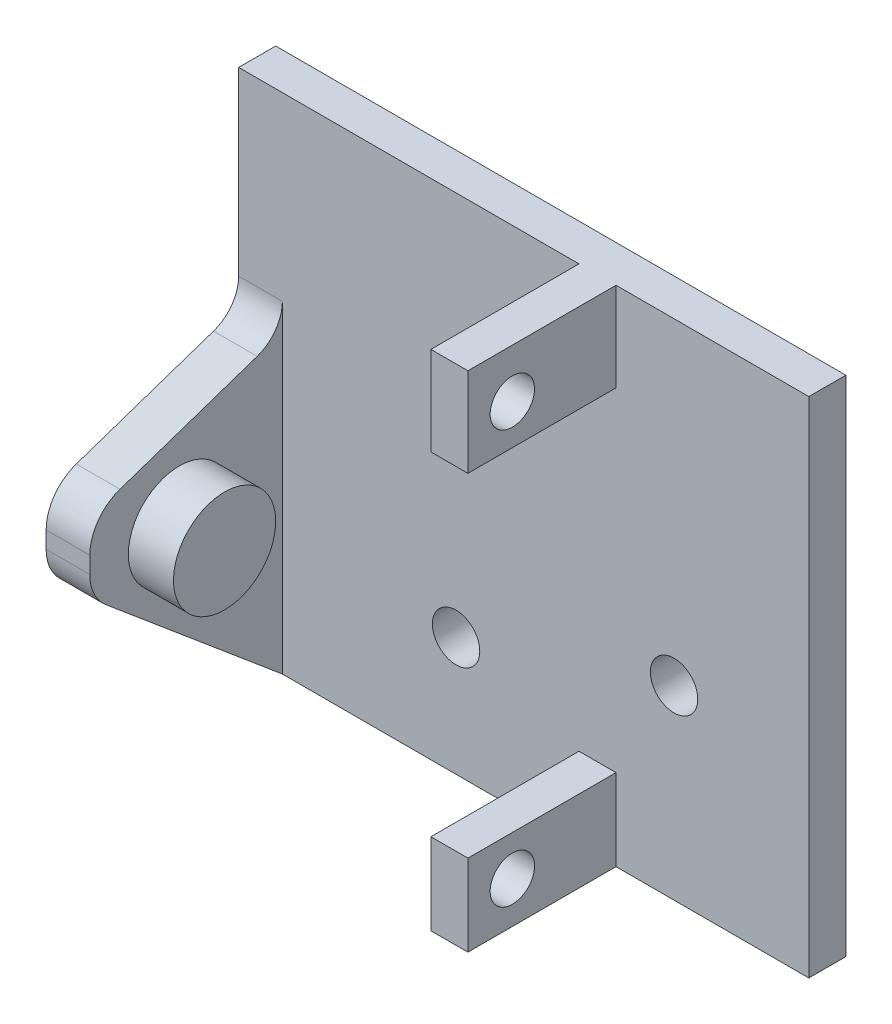
ISO-10303-21;
HEADER;
FILE_DESCRIPTION(('STEP AP214'),'2;1');
FILE_NAME('part.step','',(''),(''),'','','');
FILE_SCHEMA(('AUTOMOTIVE_DESIGN { 1 0 10303 214 1 1 1 1 }'));
ENDSEC;
DATA;
#1=APPLICATION_CONTEXT('core data for automotive mechanical design processes');
#2=APPLICATION_PROTOCOL_DEFINITION('international standard','automotive_design',2000,#1);
#3=PRODUCT_CONTEXT('',#1,'mechanical');
#4=PRODUCT('Part','Part','',(#3));
#5=PRODUCT_RELATED_PRODUCT_CATEGORY('part','',(#4));
#6=PRODUCT_DEFINITION_FORMATION('','',#4);
#7=PRODUCT_DEFINITION_CONTEXT('part definition',#1,'design');
#8=PRODUCT_DEFINITION('design','',#6,#7);
#9=PRODUCT_DEFINITION_SHAPE('','',#8);
#10=(LENGTH_UNIT() NAMED_UNIT(*) SI_UNIT(.MILLI.,.METRE.));
#11=(NAMED_UNIT(*) PLANE_ANGLE_UNIT() SI_UNIT($,.RADIAN.));
#12=(NAMED_UNIT(*) SI_UNIT($,.STERADIAN.) SOLID_ANGLE_UNIT());
#13=UNCERTAINTY_MEASURE_WITH_UNIT(LENGTH_MEASURE(1.E-05),#10,'distance_accuracy_value','');
#14=(GEOMETRIC_REPRESENTATION_CONTEXT(3) GLOBAL_UNCERTAINTY_ASSIGNED_CONTEXT((#13)) GLOBAL_UNIT_ASSIGNED_CONTEXT((#10,
#11,#12)) REPRESENTATION_CONTEXT('',''));
#15=CARTESIAN_POINT('',(0.,0.,0.));
#16=DIRECTION('',(0.,0.,1.));
#17=DIRECTION('',(1.,0.,0.));
#18=AXIS2_PLACEMENT_3D('',#15,#16,#17);
#19=CARTESIAN_POINT('',(-22.6450142317514,6.71013779527559,2.5));
#20=DIRECTION('',(1.,0.,0.));
#21=DIRECTION('',(0.,1.,0.));
#22=AXIS2_PLACEMENT_3D('',#19,#20,#21);
#23=PLANE('',#22);
#24=DIRECTION('',(0.,0.64331211729061,0.765604022812755));
#25=VECTOR('',#24,1.);
#26=CARTESIAN_POINT('',(-22.6450142317514,-17.2272454875677,14.4754931262982));
#27=LINE('',#26,#25);
#28=CARTESIAN_POINT('',(-22.6450142317514,-27.2898622047244,2.49999999999998));
#29=VERTEX_POINT('',#28);
#30=CARTESIAN_POINT('',(-22.6450142317514,-17.2655253608963,14.4299363518718));
#31=VERTEX_POINT('',#30);
#32=EDGE_CURVE('E185',#29,#31,#27,.T.);
#33=ORIENTED_EDGE('',*,*,#32,.T.);
#34=CARTESIAN_POINT('',(-22.6450142317514,-14.9687132924581,12.5));
#35=DIRECTION('',(1.,0.,0.));
#36=DIRECTION('',(0.,1.,0.));
#37=AXIS2_PLACEMENT_3D('',#34,#35,#36);
#38=CIRCLE('',#37,3.);
#39=CARTESIAN_POINT('',(-22.6450142317514,-14.9687132924581,15.5));
#40=VERTEX_POINT('',#39);
#41=EDGE_CURVE('E229',#31,#40,#38,.F.);
#42=ORIENTED_EDGE('',*,*,#41,.T.);
#43=DIRECTION('',(0.,-1.,0.));
#44=VECTOR('',#43,1.);
#45=CARTESIAN_POINT('',(-22.6450142317514,-7.28986220472441,15.5));
#46=LINE('',#45,#44);
#47=CARTESIAN_POINT('',(-22.6450142317514,-13.84136194244,15.5));
#48=VERTEX_POINT('',#47);
#49=EDGE_CURVE('E262',#48,#40,#46,.T.);
#50=ORIENTED_EDGE('',*,*,#49,.F.);
#51=CARTESIAN_POINT('',(-22.6450142317514,-13.84136194244,12.5));
#52=DIRECTION('',(1.,0.,0.));
#53=DIRECTION('',(0.,1.,0.));
#54=AXIS2_PLACEMENT_3D('',#51,#52,#53);
#55=CIRCLE('',#54,3.);
#56=CARTESIAN_POINT('',(-22.6450142317514,-10.9996910491199,13.4617206112261));
#57=VERTEX_POINT('',#56);
#58=EDGE_CURVE('E227',#48,#57,#55,.F.);
#59=ORIENTED_EDGE('',*,*,#58,.T.);
#60=DIRECTION('',(0.,0.320573537075366,-0.947223631106714));
#61=VECTOR('',#60,1.);
#62=CARTESIAN_POINT('',(-22.6450142317514,-5.78156499843623,-1.95668338554259));
#63=LINE('',#62,#61);
#64=CARTESIAN_POINT('',(-22.6450142317514,-7.86471627626999,4.19856615731159));
#65=VERTEX_POINT('',#64);
#66=EDGE_CURVE('E203',#57,#65,#63,.T.);
#67=ORIENTED_EDGE('',*,*,#66,.T.);
#68=CARTESIAN_POINT('',(-22.6450142317514,-5.49665719850321,5.));
#69=DIRECTION('',(1.,0.,0.));
#70=DIRECTION('',(0.,1.,0.));
#71=AXIS2_PLACEMENT_3D('',#68,#69,#70);
#72=CIRCLE('',#71,2.5);
#73=CARTESIAN_POINT('',(-22.6450142317514,-5.49665719850321,2.5));
#74=VERTEX_POINT('',#73);
#75=EDGE_CURVE('E66',#65,#74,#72,.T.);
#76=ORIENTED_EDGE('',*,*,#75,.T.);
#77=DIRECTION('',(0.,-1.,0.));
#78=VECTOR('',#77,1.);
#79=CARTESIAN_POINT('',(-22.6450142317514,6.71013779527559,2.5));
#80=LINE('',#79,#78);
#81=CARTESIAN_POINT('',(-22.6450142317514,6.71013779527559,2.5));
#82=VERTEX_POINT('',#81);
#83=EDGE_CURVE('E241',#82,#74,#80,.T.);
#84=ORIENTED_EDGE('',*,*,#83,.F.);
#85=DIRECTION('',(0.,0.,-1.));
#86=VECTOR('',#85,1.);
#87=CARTESIAN_POINT('',(-22.6450142317514,6.71013779527559,2.5));
#88=LINE('',#87,#86);
#89=CARTESIAN_POINT('',(-22.6450142317514,6.71013779527559,0.));
#90=VERTEX_POINT('',#89);
#91=EDGE_CURVE('E343',#82,#90,#88,.T.);
#92=ORIENTED_EDGE('',*,*,#91,.T.);
#93=DIRECTION('',(0.,-1.,0.));
#94=VECTOR('',#93,1.);
#95=CARTESIAN_POINT('',(-22.6450142317514,6.71013779527559,0.));
#96=LINE('',#95,#94);
#97=CARTESIAN_POINT('',(-22.6450142317514,-27.2898622047244,0.));
#98=VERTEX_POINT('',#97);
#99=EDGE_CURVE('E208',#90,#98,#96,.T.);
#100=ORIENTED_EDGE('',*,*,#99,.T.);
#101=DIRECTION('',(0.,0.,-1.));
#102=VECTOR('',#101,1.);
#103=CARTESIAN_POINT('',(-22.6450142317514,-27.2898622047244,2.5));
#104=LINE('',#103,#102);
#105=EDGE_CURVE('E199',#29,#98,#104,.T.);
#106=ORIENTED_EDGE('',*,*,#105,.F.);
#107=EDGE_LOOP('',(#33,#42,#50,#59,#67,#76,#84,#92,#100,#106));
#108=FACE_BOUND('',#107,.T.);
#109=ADVANCED_FACE('F58',(#108),#23,.F.);
#110=CARTESIAN_POINT('',(-22.6450142317514,-27.2898622047244,2.5));
#111=DIRECTION('',(0.,1.,0.));
#112=DIRECTION('',(0.,0.,1.));
#113=AXIS2_PLACEMENT_3D('',#110,#111,#112);
#114=PLANE('',#113);
#115=DIRECTION('',(-1.,0.,0.));
#116=VECTOR('',#115,1.);
#117=CARTESIAN_POINT('',(-7.64501423175144,-27.2898622047244,2.49999999999998));
#118=LINE('',#117,#116);
#119=CARTESIAN_POINT('',(-19.6950142317514,-27.2898622047244,2.49999999999998));
#120=VERTEX_POINT('',#119);
#121=EDGE_CURVE('E189',#120,#29,#118,.T.);
#122=ORIENTED_EDGE('',*,*,#121,.T.);
#123=ORIENTED_EDGE('',*,*,#105,.T.);
#124=DIRECTION('',(1.,0.,0.));
#125=VECTOR('',#124,1.);
#126=CARTESIAN_POINT('',(-22.6450142317514,-27.2898622047244,0.));
#127=LINE('',#126,#125);
#128=CARTESIAN_POINT('',(15.8549857682486,-27.2898622047244,0.));
#129=VERTEX_POINT('',#128);
#130=EDGE_CURVE('E345',#98,#129,#127,.T.);
#131=ORIENTED_EDGE('',*,*,#130,.T.);
#132=DIRECTION('',(0.,0.,-1.));
#133=VECTOR('',#132,1.);
#134=CARTESIAN_POINT('',(15.8549857682486,-27.2898622047244,2.5));
#135=LINE('',#134,#133);
#136=CARTESIAN_POINT('',(15.8549857682486,-27.2898622047244,2.5));
#137=VERTEX_POINT('',#136);
#138=EDGE_CURVE('E210',#137,#129,#135,.T.);
#139=ORIENTED_EDGE('',*,*,#138,.F.);
#140=DIRECTION('',(1.,0.,0.));
#141=VECTOR('',#140,1.);
#142=CARTESIAN_POINT('',(-22.6450142317514,-27.2898622047244,2.5));
#143=LINE('',#142,#141);
#144=CARTESIAN_POINT('',(2.83498576824857,-27.2898622047244,2.5));
#145=VERTEX_POINT('',#144);
#146=EDGE_CURVE('E334',#145,#137,#143,.T.);
#147=ORIENTED_EDGE('',*,*,#146,.F.);
#148=DIRECTION('',(0.,0.,-1.));
#149=VECTOR('',#148,1.);
#150=CARTESIAN_POINT('',(2.83498576824857,-27.2898622047244,12.5));
#151=LINE('',#150,#149);
#152=CARTESIAN_POINT('',(2.83498576824857,-27.2898622047244,12.5));
#153=VERTEX_POINT('',#152);
#154=EDGE_CURVE('E330',#153,#145,#151,.T.);
#155=ORIENTED_EDGE('',*,*,#154,.F.);
#156=DIRECTION('',(1.,0.,0.));
#157=VECTOR('',#156,1.);
#158=CARTESIAN_POINT('',(2.83498576824857,-27.2898622047244,12.5));
#159=LINE('',#158,#157);
#160=CARTESIAN_POINT('',(0.334985768248565,-27.2898622047244,12.5));
#161=VERTEX_POINT('',#160);
#162=EDGE_CURVE('E305',#161,#153,#159,.T.);
#163=ORIENTED_EDGE('',*,*,#162,.F.);
#164=DIRECTION('',(0.,0.,-1.));
#165=VECTOR('',#164,1.);
#166=CARTESIAN_POINT('',(0.334985768248565,-27.2898622047244,12.5));
#167=LINE('',#166,#165);
#168=CARTESIAN_POINT('',(0.334985768248565,-27.2898622047244,2.5));
#169=VERTEX_POINT('',#168);
#170=EDGE_CURVE('E315',#161,#169,#167,.T.);
#171=ORIENTED_EDGE('',*,*,#170,.T.);
#172=EDGE_CURVE('E202',#120,#169,#143,.T.);
#173=ORIENTED_EDGE('',*,*,#172,.F.);
#174=EDGE_LOOP('',(#122,#123,#131,#139,#147,#155,#163,#171,#173));
#175=FACE_BOUND('',#174,.T.);
#176=ADVANCED_FACE('F198',(#175),#114,.F.);
#177=CARTESIAN_POINT('',(-19.6950142317514,-27.2898622047244,15.5));
#178=DIRECTION('',(-1.,0.,0.));
#179=DIRECTION('',(0.,0.,1.));
#180=AXIS2_PLACEMENT_3D('',#177,#178,#179);
#181=PLANE('',#180);
#182=CARTESIAN_POINT('',(-19.6950142317514,-15.0898622047244,9.45));
#183=DIRECTION('',(-1.,0.,0.));
#184=DIRECTION('',(0.,0.,1.));
#185=AXIS2_PLACEMENT_3D('',#182,#183,#184);
#186=CIRCLE('',#185,3.45);
#187=CARTESIAN_POINT('',(-19.6950142317514,-15.0898622047244,12.9));
#188=VERTEX_POINT('',#187);
#189=EDGE_CURVE('E194',#188,#188,#186,.T.);
#190=ORIENTED_EDGE('',*,*,#189,.T.);
#191=EDGE_LOOP('',(#190));
#192=FACE_BOUND('',#191,.T.);
#193=DIRECTION('',(0.,1.,0.));
#194=VECTOR('',#193,1.);
#195=CARTESIAN_POINT('',(-19.6950142317514,-27.2898622047244,15.5));
#196=LINE('',#195,#194);
#197=CARTESIAN_POINT('',(-19.6950142317514,-14.9687132924581,15.5));
#198=VERTEX_POINT('',#197);
#199=CARTESIAN_POINT('',(-19.6950142317514,-13.84136194244,15.5));
#200=VERTEX_POINT('',#199);
#201=EDGE_CURVE('E259',#198,#200,#196,.T.);
#202=ORIENTED_EDGE('',*,*,#201,.F.);
#203=CARTESIAN_POINT('',(-19.6950142317514,-14.9687132924581,12.5));
#204=DIRECTION('',(-1.,0.,0.));
#205=DIRECTION('',(0.,0.,1.));
#206=AXIS2_PLACEMENT_3D('',#203,#204,#205);
#207=CIRCLE('',#206,3.);
#208=CARTESIAN_POINT('',(-19.6950142317514,-17.2655253608963,14.4299363518718));
#209=VERTEX_POINT('',#208);
#210=EDGE_CURVE('E224',#198,#209,#207,.F.);
#211=ORIENTED_EDGE('',*,*,#210,.T.);
#212=DIRECTION('',(0.,0.64331211729061,0.765604022812755));
#213=VECTOR('',#212,1.);
#214=CARTESIAN_POINT('',(-19.6950142317514,-20.88707172074,10.1199437567119));
#215=LINE('',#214,#213);
#216=EDGE_CURVE('E254',#120,#209,#215,.T.);
#217=ORIENTED_EDGE('',*,*,#216,.F.);
#218=DIRECTION('',(0.,1.,0.));
#219=VECTOR('',#218,1.);
#220=CARTESIAN_POINT('',(-19.6950142317514,-27.2898622047244,2.5));
#221=LINE('',#220,#219);
#222=CARTESIAN_POINT('',(-19.6950142317514,-5.49665719850321,2.5));
#223=VERTEX_POINT('',#222);
#224=EDGE_CURVE('E72',#120,#223,#221,.T.);
#225=ORIENTED_EDGE('',*,*,#224,.T.);
#226=CARTESIAN_POINT('',(-19.6950142317514,-5.49665719850321,5.));
#227=DIRECTION('',(-1.,0.,0.));
#228=DIRECTION('',(0.,0.,1.));
#229=AXIS2_PLACEMENT_3D('',#226,#227,#228);
#230=CIRCLE('',#229,2.5);
#231=CARTESIAN_POINT('',(-19.6950142317514,-7.86471627626999,4.19856615731158));
#232=VERTEX_POINT('',#231);
#233=EDGE_CURVE('E12',#223,#232,#230,.T.);
#234=ORIENTED_EDGE('',*,*,#233,.T.);
#235=DIRECTION('',(0.,0.320573537075366,-0.947223631106715));
#236=VECTOR('',#235,1.);
#237=CARTESIAN_POINT('',(-19.6950142317514,-13.2927228459129,20.2371204917559));
#238=LINE('',#237,#236);
#239=CARTESIAN_POINT('',(-19.6950142317514,-10.9996910491199,13.4617206112261));
#240=VERTEX_POINT('',#239);
#241=EDGE_CURVE('E248',#240,#232,#238,.T.);
#242=ORIENTED_EDGE('',*,*,#241,.F.);
#243=CARTESIAN_POINT('',(-19.6950142317514,-13.84136194244,12.5));
#244=DIRECTION('',(-1.,0.,0.));
#245=DIRECTION('',(0.,0.,1.));
#246=AXIS2_PLACEMENT_3D('',#243,#244,#245);
#247=CIRCLE('',#246,3.);
#248=EDGE_CURVE('E222',#240,#200,#247,.F.);
#249=ORIENTED_EDGE('',*,*,#248,.T.);
#250=EDGE_LOOP('',(#202,#211,#217,#225,#234,#242,#249));
#251=FACE_BOUND('',#250,.T.);
#252=ADVANCED_FACE('F247',(#192,#251),#181,.F.);
#253=CARTESIAN_POINT('',(0.,0.,15.5));
#254=DIRECTION('',(0.,0.,1.));
#255=DIRECTION('',(1.,0.,0.));
#256=AXIS2_PLACEMENT_3D('',#253,#254,#255);
#257=PLANE('',#256);
#258=ORIENTED_EDGE('',*,*,#49,.T.);
#259=DIRECTION('',(1.,0.,0.));
#260=VECTOR('',#259,1.);
#261=CARTESIAN_POINT('',(0.,-14.9687132924581,15.5));
#262=LINE('',#261,#260);
#263=EDGE_CURVE('E213',#40,#198,#262,.T.);
#264=ORIENTED_EDGE('',*,*,#263,.T.);
#265=ORIENTED_EDGE('',*,*,#201,.T.);
#266=DIRECTION('',(-1.,0.,0.));
#267=VECTOR('',#266,1.);
#268=CARTESIAN_POINT('',(0.,-13.84136194244,15.5));
#269=LINE('',#268,#267);
#270=EDGE_CURVE('E209',#200,#48,#269,.T.);
#271=ORIENTED_EDGE('',*,*,#270,.T.);
#272=EDGE_LOOP('',(#258,#264,#265,#271));
#273=FACE_BOUND('',#272,.T.);
#274=ADVANCED_FACE('F411',(#273),#257,.T.);
#275=CARTESIAN_POINT('',(0.,0.,2.5));
#276=DIRECTION('',(0.,0.,1.));
#277=DIRECTION('',(1.,0.,0.));
#278=AXIS2_PLACEMENT_3D('',#275,#276,#277);
#279=PLANE('',#278);
#280=CARTESIAN_POINT('',(-7.96501423175144,-19.2898622047244,2.5));
#281=DIRECTION('',(0.,0.,1.));
#282=DIRECTION('',(1.,0.,0.));
#283=AXIS2_PLACEMENT_3D('',#280,#281,#282);
#284=CIRCLE('',#283,1.6);
#285=CARTESIAN_POINT('',(-6.36501423175144,-19.2898622047244,2.5));
#286=VERTEX_POINT('',#285);
#287=EDGE_CURVE('E616',#286,#286,#284,.T.);
#288=ORIENTED_EDGE('',*,*,#287,.F.);
#289=EDGE_LOOP('',(#288));
#290=FACE_BOUND('',#289,.T.);
#291=CARTESIAN_POINT('',(6.75498576824856,-14.7398622047244,2.5));
#292=DIRECTION('',(0.,0.,1.));
#293=DIRECTION('',(1.,0.,0.));
#294=AXIS2_PLACEMENT_3D('',#291,#292,#293);
#295=CIRCLE('',#294,1.6);
#296=CARTESIAN_POINT('',(8.35498576824856,-14.7398622047244,2.5));
#297=VERTEX_POINT('',#296);
#298=EDGE_CURVE('E620',#297,#297,#295,.T.);
#299=ORIENTED_EDGE('',*,*,#298,.F.);
#300=EDGE_LOOP('',(#299));
#301=FACE_BOUND('',#300,.T.);
#302=ORIENTED_EDGE('',*,*,#83,.T.);
#303=DIRECTION('',(-1.,0.,0.));
#304=VECTOR('',#303,1.);
#305=CARTESIAN_POINT('',(-19.6950142317514,-5.49665719850321,2.5));
#306=LINE('',#305,#304);
#307=EDGE_CURVE('E236',#74,#223,#306,.F.);
#308=ORIENTED_EDGE('',*,*,#307,.T.);
#309=ORIENTED_EDGE('',*,*,#224,.F.);
#310=ORIENTED_EDGE('',*,*,#172,.T.);
#311=DIRECTION('',(0.,-1.,0.));
#312=VECTOR('',#311,1.);
#313=CARTESIAN_POINT('',(0.334985768248565,-27.2898622047244,2.5));
#314=LINE('',#313,#312);
#315=CARTESIAN_POINT('',(0.334985768248567,-21.7898622047244,2.5));
#316=VERTEX_POINT('',#315);
#317=EDGE_CURVE('E309',#316,#169,#314,.T.);
#318=ORIENTED_EDGE('',*,*,#317,.F.);
#319=DIRECTION('',(-1.,0.,0.));
#320=VECTOR('',#319,1.);
#321=CARTESIAN_POINT('',(0.334985768248567,-21.7898622047244,2.5));
#322=LINE('',#321,#320);
#323=CARTESIAN_POINT('',(2.83498576824857,-21.7898622047244,2.5));
#324=VERTEX_POINT('',#323);
#325=EDGE_CURVE('E318',#324,#316,#322,.T.);
#326=ORIENTED_EDGE('',*,*,#325,.F.);
#327=DIRECTION('',(0.,1.,0.));
#328=VECTOR('',#327,1.);
#329=CARTESIAN_POINT('',(2.83498576824857,-21.7898622047244,2.5));
#330=LINE('',#329,#328);
#331=EDGE_CURVE('E304',#145,#324,#330,.T.);
#332=ORIENTED_EDGE('',*,*,#331,.F.);
#333=ORIENTED_EDGE('',*,*,#146,.T.);
#334=DIRECTION('',(0.,1.,0.));
#335=VECTOR('',#334,1.);
#336=CARTESIAN_POINT('',(15.8549857682486,6.71013779527559,2.5));
#337=LINE('',#336,#335);
#338=CARTESIAN_POINT('',(15.8549857682486,6.71013779527559,2.5));
#339=VERTEX_POINT('',#338);
#340=EDGE_CURVE('E337',#137,#339,#337,.T.);
#341=ORIENTED_EDGE('',*,*,#340,.T.);
#342=DIRECTION('',(-1.,0.,0.));
#343=VECTOR('',#342,1.);
#344=CARTESIAN_POINT('',(-22.6450142317514,6.71013779527559,2.5));
#345=LINE('',#344,#343);
#346=CARTESIAN_POINT('',(2.83498576824856,6.71013779527559,2.5));
#347=VERTEX_POINT('',#346);
#348=EDGE_CURVE('E340',#339,#347,#345,.T.);
#349=ORIENTED_EDGE('',*,*,#348,.T.);
#350=DIRECTION('',(0.,1.,0.));
#351=VECTOR('',#350,1.);
#352=CARTESIAN_POINT('',(2.83498576824856,6.71013779527559,2.5));
#353=LINE('',#352,#351);
#354=CARTESIAN_POINT('',(2.83498576824856,0.710137795275591,2.5));
#355=VERTEX_POINT('',#354);
#356=EDGE_CURVE('E283',#355,#347,#353,.T.);
#357=ORIENTED_EDGE('',*,*,#356,.F.);
#358=DIRECTION('',(1.,0.,0.));
#359=VECTOR('',#358,1.);
#360=CARTESIAN_POINT('',(0.334985768248563,0.710137795275591,2.5));
#361=LINE('',#360,#359);
#362=CARTESIAN_POINT('',(0.334985768248563,0.710137795275591,2.5));
#363=VERTEX_POINT('',#362);
#364=EDGE_CURVE('E291',#363,#355,#361,.T.);
#365=ORIENTED_EDGE('',*,*,#364,.F.);
#366=DIRECTION('',(0.,-1.,0.));
#367=VECTOR('',#366,1.);
#368=CARTESIAN_POINT('',(0.334985768248563,6.71013779527559,2.5));
#369=LINE('',#368,#367);
#370=CARTESIAN_POINT('',(0.334985768248563,6.71013779527559,2.5));
#371=VERTEX_POINT('',#370);
#372=EDGE_CURVE('E274',#371,#363,#369,.T.);
#373=ORIENTED_EDGE('',*,*,#372,.F.);
#374=EDGE_CURVE('E339',#371,#82,#345,.T.);
#375=ORIENTED_EDGE('',*,*,#374,.T.);
#376=EDGE_LOOP('',(#302,#308,#309,#310,#318,#326,#332,#333,#341,#349,#357,#365,#373,#375));
#377=FACE_BOUND('',#376,.T.);
#378=ADVANCED_FACE('F240',(#290,#301,#377),#279,.T.);
#379=CARTESIAN_POINT('',(15.8549857682486,6.71013779527559,2.5));
#380=DIRECTION('',(-1.,0.,0.));
#381=DIRECTION('',(0.,-1.,0.));
#382=AXIS2_PLACEMENT_3D('',#379,#380,#381);
#383=PLANE('',#382);
#384=DIRECTION('',(0.,1.,0.));
#385=VECTOR('',#384,1.);
#386=CARTESIAN_POINT('',(15.8549857682486,6.71013779527559,0.));
#387=LINE('',#386,#385);
#388=CARTESIAN_POINT('',(15.8549857682486,6.71013779527559,0.));
#389=VERTEX_POINT('',#388);
#390=EDGE_CURVE('E347',#129,#389,#387,.T.);
#391=ORIENTED_EDGE('',*,*,#390,.T.);
#392=DIRECTION('',(0.,0.,-1.));
#393=VECTOR('',#392,1.);
#394=CARTESIAN_POINT('',(15.8549857682486,6.71013779527559,2.5));
#395=LINE('',#394,#393);
#396=EDGE_CURVE('E216',#339,#389,#395,.T.);
#397=ORIENTED_EDGE('',*,*,#396,.F.);
#398=ORIENTED_EDGE('',*,*,#340,.F.);
#399=ORIENTED_EDGE('',*,*,#138,.T.);
#400=EDGE_LOOP('',(#391,#397,#398,#399));
#401=FACE_BOUND('',#400,.T.);
#402=ADVANCED_FACE('F364',(#401),#383,.F.);
#403=CARTESIAN_POINT('',(-22.6450142317514,6.71013779527559,2.5));
#404=DIRECTION('',(0.,-1.,0.));
#405=DIRECTION('',(0.,0.,-1.));
#406=AXIS2_PLACEMENT_3D('',#403,#404,#405);
#407=PLANE('',#406);
#408=DIRECTION('',(-1.,0.,0.));
#409=VECTOR('',#408,1.);
#410=CARTESIAN_POINT('',(-22.6450142317514,6.71013779527559,0.));
#411=LINE('',#410,#409);
#412=EDGE_CURVE('E335',#389,#90,#411,.T.);
#413=ORIENTED_EDGE('',*,*,#412,.T.);
#414=ORIENTED_EDGE('',*,*,#91,.F.);
#415=ORIENTED_EDGE('',*,*,#374,.F.);
#416=DIRECTION('',(0.,0.,-1.));
#417=VECTOR('',#416,1.);
#418=CARTESIAN_POINT('',(0.334985768248563,6.71013779527559,12.5));
#419=LINE('',#418,#417);
#420=CARTESIAN_POINT('',(0.334985768248563,6.71013779527559,12.5));
#421=VERTEX_POINT('',#420);
#422=EDGE_CURVE('E302',#421,#371,#419,.T.);
#423=ORIENTED_EDGE('',*,*,#422,.F.);
#424=DIRECTION('',(-1.,0.,0.));
#425=VECTOR('',#424,1.);
#426=CARTESIAN_POINT('',(0.334985768248563,6.71013779527559,12.5));
#427=LINE('',#426,#425);
#428=CARTESIAN_POINT('',(2.83498576824856,6.71013779527559,12.5));
#429=VERTEX_POINT('',#428);
#430=EDGE_CURVE('E279',#429,#421,#427,.T.);
#431=ORIENTED_EDGE('',*,*,#430,.F.);
#432=DIRECTION('',(0.,0.,-1.));
#433=VECTOR('',#432,1.);
#434=CARTESIAN_POINT('',(2.83498576824856,6.71013779527559,12.5));
#435=LINE('',#434,#433);
#436=EDGE_CURVE('E289',#429,#347,#435,.T.);
#437=ORIENTED_EDGE('',*,*,#436,.T.);
#438=ORIENTED_EDGE('',*,*,#348,.F.);
#439=ORIENTED_EDGE('',*,*,#396,.T.);
#440=EDGE_LOOP('',(#413,#414,#415,#423,#431,#437,#438,#439));
#441=FACE_BOUND('',#440,.T.);
#442=ADVANCED_FACE('F355',(#441),#407,.F.);
#443=CARTESIAN_POINT('',(0.,0.,0.));
#444=DIRECTION('',(0.,0.,1.));
#445=DIRECTION('',(1.,0.,0.));
#446=AXIS2_PLACEMENT_3D('',#443,#444,#445);
#447=PLANE('',#446);
#448=CARTESIAN_POINT('',(-7.96501423175144,-19.2898622047244,0.));
#449=DIRECTION('',(0.,0.,-1.));
#450=DIRECTION('',(-1.,0.,0.));
#451=AXIS2_PLACEMENT_3D('',#448,#449,#450);
#452=CIRCLE('',#451,1.6);
#453=CARTESIAN_POINT('',(-9.56501423175144,-19.2898622047244,0.));
#454=VERTEX_POINT('',#453);
#455=EDGE_CURVE('E623',#454,#454,#452,.T.);
#456=ORIENTED_EDGE('',*,*,#455,.F.);
#457=EDGE_LOOP('',(#456));
#458=FACE_BOUND('',#457,.T.);
#459=CARTESIAN_POINT('',(6.75498576824856,-14.7398622047244,0.));
#460=DIRECTION('',(0.,0.,-1.));
#461=DIRECTION('',(-1.,0.,0.));
#462=AXIS2_PLACEMENT_3D('',#459,#460,#461);
#463=CIRCLE('',#462,1.6);
#464=CARTESIAN_POINT('',(5.15498576824856,-14.7398622047244,0.));
#465=VERTEX_POINT('',#464);
#466=EDGE_CURVE('E624',#465,#465,#463,.T.);
#467=ORIENTED_EDGE('',*,*,#466,.F.);
#468=EDGE_LOOP('',(#467));
#469=FACE_BOUND('',#468,.T.);
#470=ORIENTED_EDGE('',*,*,#99,.F.);
#471=ORIENTED_EDGE('',*,*,#412,.F.);
#472=ORIENTED_EDGE('',*,*,#390,.F.);
#473=ORIENTED_EDGE('',*,*,#130,.F.);
#474=EDGE_LOOP('',(#470,#471,#472,#473));
#475=FACE_BOUND('',#474,.T.);
#476=ADVANCED_FACE('F361',(#458,#469,#475),#447,.F.);
#477=CARTESIAN_POINT('',(2.83498576824857,-21.7898622047244,12.5));
#478=DIRECTION('',(-1.,0.,0.));
#479=DIRECTION('',(0.,-1.,0.));
#480=AXIS2_PLACEMENT_3D('',#477,#478,#479);
#481=PLANE('',#480);
#482=CARTESIAN_POINT('',(2.83498576824856,-24.4898622047244,9.5));
#483=DIRECTION('',(1.,0.,0.));
#484=DIRECTION('',(0.,1.,0.));
#485=AXIS2_PLACEMENT_3D('',#482,#483,#484);
#486=CIRCLE('',#485,1.5);
#487=CARTESIAN_POINT('',(2.83498576824856,-22.9898622047244,9.5));
#488=VERTEX_POINT('',#487);
#489=EDGE_CURVE('E265',#488,#488,#486,.T.);
#490=ORIENTED_EDGE('',*,*,#489,.F.);
#491=EDGE_LOOP('',(#490));
#492=FACE_BOUND('',#491,.T.);
#493=ORIENTED_EDGE('',*,*,#331,.T.);
#494=DIRECTION('',(0.,0.,-1.));
#495=VECTOR('',#494,1.);
#496=CARTESIAN_POINT('',(2.83498576824857,-21.7898622047244,12.5));
#497=LINE('',#496,#495);
#498=CARTESIAN_POINT('',(2.83498576824857,-21.7898622047244,12.5));
#499=VERTEX_POINT('',#498);
#500=EDGE_CURVE('E327',#499,#324,#497,.T.);
#501=ORIENTED_EDGE('',*,*,#500,.F.);
#502=DIRECTION('',(0.,1.,0.));
#503=VECTOR('',#502,1.);
#504=CARTESIAN_POINT('',(2.83498576824857,-21.7898622047244,12.5));
#505=LINE('',#504,#503);
#506=EDGE_CURVE('E308',#153,#499,#505,.T.);
#507=ORIENTED_EDGE('',*,*,#506,.F.);
#508=ORIENTED_EDGE('',*,*,#154,.T.);
#509=EDGE_LOOP('',(#493,#501,#507,#508));
#510=FACE_BOUND('',#509,.T.);
#511=ADVANCED_FACE('F369',(#492,#510),#481,.F.);
#512=CARTESIAN_POINT('',(0.334985768248567,-21.7898622047244,12.5));
#513=DIRECTION('',(0.,-1.,0.));
#514=DIRECTION('',(0.,0.,-1.));
#515=AXIS2_PLACEMENT_3D('',#512,#513,#514);
#516=PLANE('',#515);
#517=ORIENTED_EDGE('',*,*,#325,.T.);
#518=DIRECTION('',(0.,0.,-1.));
#519=VECTOR('',#518,1.);
#520=CARTESIAN_POINT('',(0.334985768248567,-21.7898622047244,12.5));
#521=LINE('',#520,#519);
#522=CARTESIAN_POINT('',(0.334985768248567,-21.7898622047244,12.5));
#523=VERTEX_POINT('',#522);
#524=EDGE_CURVE('E324',#523,#316,#521,.T.);
#525=ORIENTED_EDGE('',*,*,#524,.F.);
#526=DIRECTION('',(-1.,0.,0.));
#527=VECTOR('',#526,1.);
#528=CARTESIAN_POINT('',(0.334985768248567,-21.7898622047244,12.5));
#529=LINE('',#528,#527);
#530=EDGE_CURVE('E311',#499,#523,#529,.T.);
#531=ORIENTED_EDGE('',*,*,#530,.F.);
#532=ORIENTED_EDGE('',*,*,#500,.T.);
#533=EDGE_LOOP('',(#517,#525,#531,#532));
#534=FACE_BOUND('',#533,.T.);
#535=ADVANCED_FACE('F380',(#534),#516,.F.);
#536=CARTESIAN_POINT('',(0.334985768248565,-27.2898622047244,12.5));
#537=DIRECTION('',(1.,0.,0.));
#538=DIRECTION('',(0.,1.,0.));
#539=AXIS2_PLACEMENT_3D('',#536,#537,#538);
#540=PLANE('',#539);
#541=CARTESIAN_POINT('',(0.334985768248565,-24.4898622047244,9.5));
#542=DIRECTION('',(1.,0.,0.));
#543=DIRECTION('',(0.,1.,0.));
#544=AXIS2_PLACEMENT_3D('',#541,#542,#543);
#545=CIRCLE('',#544,1.5);
#546=CARTESIAN_POINT('',(0.334985768248565,-22.9898622047244,9.5));
#547=VERTEX_POINT('',#546);
#548=EDGE_CURVE('E271',#547,#547,#545,.F.);
#549=ORIENTED_EDGE('',*,*,#548,.F.);
#550=EDGE_LOOP('',(#549));
#551=FACE_BOUND('',#550,.T.);
#552=ORIENTED_EDGE('',*,*,#317,.T.);
#553=ORIENTED_EDGE('',*,*,#170,.F.);
#554=DIRECTION('',(0.,-1.,0.));
#555=VECTOR('',#554,1.);
#556=CARTESIAN_POINT('',(0.334985768248565,-27.2898622047244,12.5));
#557=LINE('',#556,#555);
#558=EDGE_CURVE('E313',#523,#161,#557,.T.);
#559=ORIENTED_EDGE('',*,*,#558,.F.);
#560=ORIENTED_EDGE('',*,*,#524,.T.);
#561=EDGE_LOOP('',(#552,#553,#559,#560));
#562=FACE_BOUND('',#561,.T.);
#563=ADVANCED_FACE('F377',(#551,#562),#540,.F.);
#564=CARTESIAN_POINT('',(0.,0.,12.5));
#565=DIRECTION('',(0.,0.,-1.));
#566=DIRECTION('',(-1.,0.,0.));
#567=AXIS2_PLACEMENT_3D('',#564,#565,#566);
#568=PLANE('',#567);
#569=ORIENTED_EDGE('',*,*,#162,.T.);
#570=ORIENTED_EDGE('',*,*,#506,.T.);
#571=ORIENTED_EDGE('',*,*,#530,.T.);
#572=ORIENTED_EDGE('',*,*,#558,.T.);
#573=EDGE_LOOP('',(#569,#570,#571,#572));
#574=FACE_BOUND('',#573,.T.);
#575=ADVANCED_FACE('F373',(#574),#568,.F.);
#576=CARTESIAN_POINT('',(0.334985768248563,6.71013779527559,12.5));
#577=DIRECTION('',(1.,0.,0.));
#578=DIRECTION('',(0.,1.,0.));
#579=AXIS2_PLACEMENT_3D('',#576,#577,#578);
#580=PLANE('',#579);
#581=CARTESIAN_POINT('',(0.334985768248561,3.41013779527559,9.5));
#582=DIRECTION('',(1.,0.,0.));
#583=DIRECTION('',(0.,1.,0.));
#584=AXIS2_PLACEMENT_3D('',#581,#582,#583);
#585=CIRCLE('',#584,1.5);
#586=CARTESIAN_POINT('',(0.334985768248561,4.91013779527559,9.5));
#587=VERTEX_POINT('',#586);
#588=EDGE_CURVE('E270',#587,#587,#585,.F.);
#589=ORIENTED_EDGE('',*,*,#588,.F.);
#590=EDGE_LOOP('',(#589));
#591=FACE_BOUND('',#590,.T.);
#592=ORIENTED_EDGE('',*,*,#372,.T.);
#593=DIRECTION('',(0.,0.,-1.));
#594=VECTOR('',#593,1.);
#595=CARTESIAN_POINT('',(0.334985768248563,0.710137795275591,12.5));
#596=LINE('',#595,#594);
#597=CARTESIAN_POINT('',(0.334985768248563,0.710137795275591,12.5));
#598=VERTEX_POINT('',#597);
#599=EDGE_CURVE('E299',#598,#363,#596,.T.);
#600=ORIENTED_EDGE('',*,*,#599,.F.);
#601=DIRECTION('',(0.,-1.,0.));
#602=VECTOR('',#601,1.);
#603=CARTESIAN_POINT('',(0.334985768248563,6.71013779527559,12.5));
#604=LINE('',#603,#602);
#605=EDGE_CURVE('E282',#421,#598,#604,.T.);
#606=ORIENTED_EDGE('',*,*,#605,.F.);
#607=ORIENTED_EDGE('',*,*,#422,.T.);
#608=EDGE_LOOP('',(#592,#600,#606,#607));
#609=FACE_BOUND('',#608,.T.);
#610=ADVANCED_FACE('F446',(#591,#609),#580,.F.);
#611=CARTESIAN_POINT('',(0.334985768248563,0.710137795275591,12.5));
#612=DIRECTION('',(0.,1.,0.));
#613=DIRECTION('',(-1.,0.,0.));
#614=AXIS2_PLACEMENT_3D('',#611,#612,#613);
#615=PLANE('',#614);
#616=ORIENTED_EDGE('',*,*,#364,.T.);
#617=DIRECTION('',(0.,0.,-1.));
#618=VECTOR('',#617,1.);
#619=CARTESIAN_POINT('',(2.83498576824856,0.710137795275591,12.5));
#620=LINE('',#619,#618);
#621=CARTESIAN_POINT('',(2.83498576824856,0.710137795275591,12.5));
#622=VERTEX_POINT('',#621);
#623=EDGE_CURVE('E297',#622,#355,#620,.T.);
#624=ORIENTED_EDGE('',*,*,#623,.F.);
#625=DIRECTION('',(1.,0.,0.));
#626=VECTOR('',#625,1.);
#627=CARTESIAN_POINT('',(0.334985768248563,0.710137795275591,12.5));
#628=LINE('',#627,#626);
#629=EDGE_CURVE('E285',#598,#622,#628,.T.);
#630=ORIENTED_EDGE('',*,*,#629,.F.);
#631=ORIENTED_EDGE('',*,*,#599,.T.);
#632=EDGE_LOOP('',(#616,#624,#630,#631));
#633=FACE_BOUND('',#632,.T.);
#634=ADVANCED_FACE('F442',(#633),#615,.F.);
#635=CARTESIAN_POINT('',(2.83498576824856,6.71013779527559,12.5));
#636=DIRECTION('',(-1.,0.,0.));
#637=DIRECTION('',(0.,-1.,0.));
#638=AXIS2_PLACEMENT_3D('',#635,#636,#637);
#639=PLANE('',#638);
#640=CARTESIAN_POINT('',(2.83498576824856,3.41013779527559,9.5));
#641=DIRECTION('',(1.,0.,0.));
#642=DIRECTION('',(0.,1.,0.));
#643=AXIS2_PLACEMENT_3D('',#640,#641,#642);
#644=CIRCLE('',#643,1.5);
#645=CARTESIAN_POINT('',(2.83498576824856,4.91013779527559,9.5));
#646=VERTEX_POINT('',#645);
#647=EDGE_CURVE('E267',#646,#646,#644,.T.);
#648=ORIENTED_EDGE('',*,*,#647,.F.);
#649=EDGE_LOOP('',(#648));
#650=FACE_BOUND('',#649,.T.);
#651=ORIENTED_EDGE('',*,*,#356,.T.);
#652=ORIENTED_EDGE('',*,*,#436,.F.);
#653=DIRECTION('',(0.,1.,0.));
#654=VECTOR('',#653,1.);
#655=CARTESIAN_POINT('',(2.83498576824856,6.71013779527559,12.5));
#656=LINE('',#655,#654);
#657=EDGE_CURVE('E287',#622,#429,#656,.T.);
#658=ORIENTED_EDGE('',*,*,#657,.F.);
#659=ORIENTED_EDGE('',*,*,#623,.T.);
#660=EDGE_LOOP('',(#651,#652,#658,#659));
#661=FACE_BOUND('',#660,.T.);
#662=ADVANCED_FACE('F438',(#650,#661),#639,.F.);
#663=CARTESIAN_POINT('',(0.,0.,12.5));
#664=DIRECTION('',(0.,0.,-1.));
#665=DIRECTION('',(-1.,0.,0.));
#666=AXIS2_PLACEMENT_3D('',#663,#664,#665);
#667=PLANE('',#666);
#668=ORIENTED_EDGE('',*,*,#430,.T.);
#669=ORIENTED_EDGE('',*,*,#605,.T.);
#670=ORIENTED_EDGE('',*,*,#629,.T.);
#671=ORIENTED_EDGE('',*,*,#657,.T.);
#672=EDGE_LOOP('',(#668,#669,#670,#671));
#673=FACE_BOUND('',#672,.T.);
#674=ADVANCED_FACE('F431',(#673),#667,.F.);
#675=CARTESIAN_POINT('',(-22.6460142317514,3.41013779527559,9.5));
#676=DIRECTION('',(1.,0.,0.));
#677=DIRECTION('',(0.,1.,0.));
#678=AXIS2_PLACEMENT_3D('',#675,#676,#677);
#679=CYLINDRICAL_SURFACE('',#678,1.5);
#680=ORIENTED_EDGE('',*,*,#647,.T.);
#681=EDGE_LOOP('',(#680));
#682=FACE_BOUND('',#681,.T.);
#683=ORIENTED_EDGE('',*,*,#588,.T.);
#684=EDGE_LOOP('',(#683));
#685=FACE_BOUND('',#684,.T.);
#686=ADVANCED_FACE('F427',(#682,#685),#679,.F.);
#687=CARTESIAN_POINT('',(-22.6460142317514,-24.4898622047244,9.5));
#688=DIRECTION('',(1.,0.,0.));
#689=DIRECTION('',(0.,1.,0.));
#690=AXIS2_PLACEMENT_3D('',#687,#688,#689);
#691=CYLINDRICAL_SURFACE('',#690,1.5);
#692=ORIENTED_EDGE('',*,*,#489,.T.);
#693=EDGE_LOOP('',(#692));
#694=FACE_BOUND('',#693,.T.);
#695=ORIENTED_EDGE('',*,*,#548,.T.);
#696=EDGE_LOOP('',(#695));
#697=FACE_BOUND('',#696,.T.);
#698=ADVANCED_FACE('F430',(#694,#697),#691,.F.);
#699=CARTESIAN_POINT('',(-7.64501423175144,-5.78156499843623,-1.95668338554259));
#700=DIRECTION('',(0.,0.947223631106714,0.320573537075366));
#701=DIRECTION('',(0.,-0.320573537075366,0.947223631106714));
#702=AXIS2_PLACEMENT_3D('',#699,#700,#701);
#703=PLANE('',#702);
#704=ORIENTED_EDGE('',*,*,#241,.T.);
#705=DIRECTION('',(-1.,0.,0.));
#706=VECTOR('',#705,1.);
#707=CARTESIAN_POINT('',(-22.6450142317514,-7.86471627626999,4.19856615731159));
#708=LINE('',#707,#706);
#709=EDGE_CURVE('E233',#232,#65,#708,.T.);
#710=ORIENTED_EDGE('',*,*,#709,.T.);
#711=ORIENTED_EDGE('',*,*,#66,.F.);
#712=DIRECTION('',(-1.,0.,0.));
#713=VECTOR('',#712,1.);
#714=CARTESIAN_POINT('',(-7.64501423175144,-10.9996910491199,13.4617206112261));
#715=LINE('',#714,#713);
#716=EDGE_CURVE('E231',#57,#240,#715,.F.);
#717=ORIENTED_EDGE('',*,*,#716,.T.);
#718=EDGE_LOOP('',(#704,#710,#711,#717));
#719=FACE_BOUND('',#718,.T.);
#720=ADVANCED_FACE('F251',(#719),#703,.T.);
#721=CARTESIAN_POINT('',(-7.64501423175144,-17.2272454875677,14.4754931262982));
#722=DIRECTION('',(0.,-0.765604022812755,0.64331211729061));
#723=DIRECTION('',(0.,-0.64331211729061,-0.765604022812755));
#724=AXIS2_PLACEMENT_3D('',#721,#722,#723);
#725=PLANE('',#724);
#726=ORIENTED_EDGE('',*,*,#216,.T.);
#727=DIRECTION('',(1.,0.,0.));
#728=VECTOR('',#727,1.);
#729=CARTESIAN_POINT('',(-7.64501423175144,-17.2655253608963,14.4299363518718));
#730=LINE('',#729,#728);
#731=EDGE_CURVE('E191',#209,#31,#730,.F.);
#732=ORIENTED_EDGE('',*,*,#731,.T.);
#733=ORIENTED_EDGE('',*,*,#32,.F.);
#734=ORIENTED_EDGE('',*,*,#121,.F.);
#735=EDGE_LOOP('',(#726,#732,#733,#734));
#736=FACE_BOUND('',#735,.T.);
#737=ADVANCED_FACE('F188',(#736),#725,.T.);
#738=CARTESIAN_POINT('',(0.,-14.9687132924581,12.5));
#739=DIRECTION('',(1.,0.,0.));
#740=DIRECTION('',(0.,1.,0.));
#741=AXIS2_PLACEMENT_3D('',#738,#739,#740);
#742=CYLINDRICAL_SURFACE('',#741,3.);
#743=ORIENTED_EDGE('',*,*,#41,.F.);
#744=ORIENTED_EDGE('',*,*,#731,.F.);
#745=ORIENTED_EDGE('',*,*,#210,.F.);
#746=ORIENTED_EDGE('',*,*,#263,.F.);
#747=EDGE_LOOP('',(#743,#744,#745,#746));
#748=FACE_BOUND('',#747,.T.);
#749=ADVANCED_FACE('F399',(#748),#742,.T.);
#750=CARTESIAN_POINT('',(0.,-13.84136194244,12.5));
#751=DIRECTION('',(-1.,0.,0.));
#752=DIRECTION('',(0.,-1.,0.));
#753=AXIS2_PLACEMENT_3D('',#750,#751,#752);
#754=CYLINDRICAL_SURFACE('',#753,3.);
#755=ORIENTED_EDGE('',*,*,#248,.F.);
#756=ORIENTED_EDGE('',*,*,#716,.F.);
#757=ORIENTED_EDGE('',*,*,#58,.F.);
#758=ORIENTED_EDGE('',*,*,#270,.F.);
#759=EDGE_LOOP('',(#755,#756,#757,#758));
#760=FACE_BOUND('',#759,.T.);
#761=ADVANCED_FACE('F401',(#760),#754,.T.);
#762=CARTESIAN_POINT('',(-7.64501423175144,-5.49665719850321,5.));
#763=DIRECTION('',(1.,0.,0.));
#764=DIRECTION('',(0.,1.,0.));
#765=AXIS2_PLACEMENT_3D('',#762,#763,#764);
#766=CYLINDRICAL_SURFACE('',#765,2.5);
#767=ORIENTED_EDGE('',*,*,#233,.F.);
#768=ORIENTED_EDGE('',*,*,#307,.F.);
#769=ORIENTED_EDGE('',*,*,#75,.F.);
#770=ORIENTED_EDGE('',*,*,#709,.F.);
#771=EDGE_LOOP('',(#767,#768,#769,#770));
#772=FACE_BOUND('',#771,.T.);
#773=ADVANCED_FACE('F60',(#772),#766,.F.);
#774=CARTESIAN_POINT('',(-16.6450142317514,-15.0898622047244,9.45));
#775=DIRECTION('',(-1.,0.,0.));
#776=DIRECTION('',(0.,-1.,0.));
#777=AXIS2_PLACEMENT_3D('',#774,#775,#776);
#778=CYLINDRICAL_SURFACE('',#777,3.45);
#779=CARTESIAN_POINT('',(-16.6450142317514,-15.0898622047244,9.45));
#780=DIRECTION('',(-1.,0.,0.));
#781=DIRECTION('',(0.,-1.,0.));
#782=AXIS2_PLACEMENT_3D('',#779,#780,#781);
#783=CIRCLE('',#782,3.45);
#784=CARTESIAN_POINT('',(-16.6450142317514,-18.5398622047244,9.45));
#785=VERTEX_POINT('',#784);
#786=EDGE_CURVE('E612',#785,#785,#783,.T.);
#787=ORIENTED_EDGE('',*,*,#786,.T.);
#788=EDGE_LOOP('',(#787));
#789=FACE_BOUND('',#788,.T.);
#790=ORIENTED_EDGE('',*,*,#189,.F.);
#791=EDGE_LOOP('',(#790));
#792=FACE_BOUND('',#791,.T.);
#793=ADVANCED_FACE('F408',(#789,#792),#778,.T.);
#794=CARTESIAN_POINT('',(-16.6450142317514,-15.0898622047244,9.45));
#795=DIRECTION('',(-1.,0.,0.));
#796=DIRECTION('',(0.,-1.,0.));
#797=AXIS2_PLACEMENT_3D('',#794,#795,#796);
#798=PLANE('',#797);
#799=ORIENTED_EDGE('',*,*,#786,.F.);
#800=EDGE_LOOP('',(#799));
#801=FACE_BOUND('',#800,.T.);
#802=ADVANCED_FACE('F584',(#801),#798,.F.);
#803=CARTESIAN_POINT('',(6.75498576824856,-14.7398622047244,6.));
#804=DIRECTION('',(0.,0.,-1.));
#805=DIRECTION('',(-1.,0.,0.));
#806=AXIS2_PLACEMENT_3D('',#803,#804,#805);
#807=CYLINDRICAL_SURFACE('',#806,1.6);
#808=ORIENTED_EDGE('',*,*,#298,.T.);
#809=EDGE_LOOP('',(#808));
#810=FACE_BOUND('',#809,.T.);
#811=ORIENTED_EDGE('',*,*,#466,.T.);
#812=EDGE_LOOP('',(#811));
#813=FACE_BOUND('',#812,.T.);
#814=ADVANCED_FACE('F578',(#810,#813),#807,.F.);
#815=CARTESIAN_POINT('',(-7.96501423175144,-19.2898622047244,6.));
#816=DIRECTION('',(0.,0.,-1.));
#817=DIRECTION('',(-1.,0.,0.));
#818=AXIS2_PLACEMENT_3D('',#815,#816,#817);
#819=CYLINDRICAL_SURFACE('',#818,1.6);
#820=ORIENTED_EDGE('',*,*,#287,.T.);
#821=EDGE_LOOP('',(#820));
#822=FACE_BOUND('',#821,.T.);
#823=ORIENTED_EDGE('',*,*,#455,.T.);
#824=EDGE_LOOP('',(#823));
#825=FACE_BOUND('',#824,.T.);
#826=ADVANCED_FACE('F583',(#822,#825),#819,.F.);
#827=CLOSED_SHELL('',(#109,#176,#252,#274,#378,#402,#442,#476,#511,#535,#563,#575,#610,#634,
#662,#674,#686,#698,#720,#737,#749,#761,#773,#793,#802,#814,#826));
#828=MANIFOLD_SOLID_BREP('B2',#827);
#829=ADVANCED_BREP_SHAPE_REPRESENTATION('',(#18,#828),#14);
#830=SHAPE_DEFINITION_REPRESENTATION(#9,#829);
ENDSEC;
END-ISO-10303-21;
